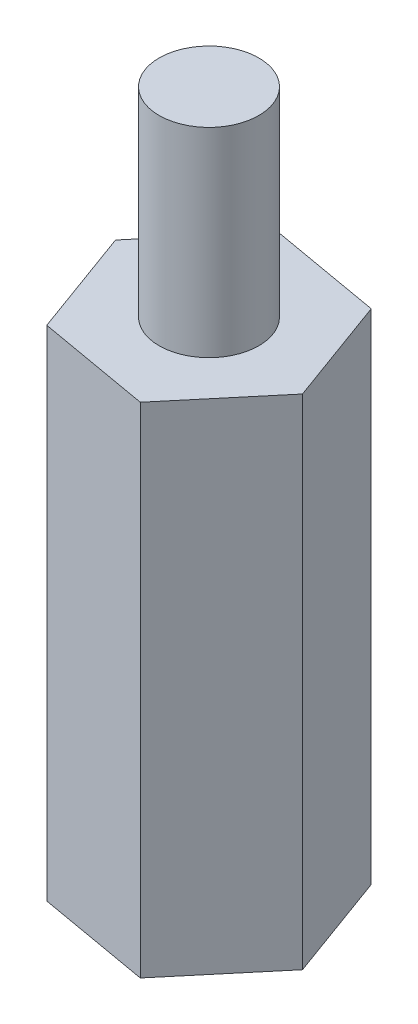
ISO-10303-21;
HEADER;
FILE_DESCRIPTION(('STEP AP214'),'2;1');
FILE_NAME('part.step','',(''),(''),'','','');
FILE_SCHEMA(('AUTOMOTIVE_DESIGN { 1 0 10303 214 1 1 1 1 }'));
ENDSEC;
DATA;
#1=APPLICATION_CONTEXT('core data for automotive mechanical design processes');
#2=APPLICATION_PROTOCOL_DEFINITION('international standard','automotive_design',2000,#1);
#3=PRODUCT_CONTEXT('',#1,'mechanical');
#4=PRODUCT('Part','Part','',(#3));
#5=PRODUCT_RELATED_PRODUCT_CATEGORY('part','',(#4));
#6=PRODUCT_DEFINITION_FORMATION('','',#4);
#7=PRODUCT_DEFINITION_CONTEXT('part definition',#1,'design');
#8=PRODUCT_DEFINITION('design','',#6,#7);
#9=PRODUCT_DEFINITION_SHAPE('','',#8);
#10=(LENGTH_UNIT() NAMED_UNIT(*) SI_UNIT(.MILLI.,.METRE.));
#11=(NAMED_UNIT(*) PLANE_ANGLE_UNIT() SI_UNIT($,.RADIAN.));
#12=(NAMED_UNIT(*) SI_UNIT($,.STERADIAN.) SOLID_ANGLE_UNIT());
#13=UNCERTAINTY_MEASURE_WITH_UNIT(LENGTH_MEASURE(1.E-05),#10,'distance_accuracy_value','');
#14=(GEOMETRIC_REPRESENTATION_CONTEXT(3) GLOBAL_UNCERTAINTY_ASSIGNED_CONTEXT((#13)) GLOBAL_UNIT_ASSIGNED_CONTEXT((#10,
#11,#12)) REPRESENTATION_CONTEXT('',''));
#15=CARTESIAN_POINT('',(0.,0.,0.));
#16=DIRECTION('',(0.,0.,1.));
#17=DIRECTION('',(1.,0.,0.));
#18=AXIS2_PLACEMENT_3D('',#15,#16,#17);
#19=CARTESIAN_POINT('',(-2.22472108843518,15.,2.65529962126156));
#20=DIRECTION('',(0.172920784330176,0.,-0.984935735135362));
#21=DIRECTION('',(-0.984935735135362,0.,-0.172920784330176));
#22=AXIS2_PLACEMENT_3D('',#19,#20,#21);
#23=PLANE('',#22);
#24=DIRECTION('',(0.984935735135362,0.,0.172920784330176));
#25=VECTOR('',#24,1.);
#26=CARTESIAN_POINT('',(-2.22472108843518,0.,2.65529962126156));
#27=LINE('',#26,#25);
#28=CARTESIAN_POINT('',(-2.22472108843518,0.,2.65529962126156));
#29=VERTEX_POINT('',#28);
#30=CARTESIAN_POINT('',(1.18719638245412,0.,3.25431478955061));
#31=VERTEX_POINT('',#30);
#32=EDGE_CURVE('E121',#29,#31,#27,.T.);
#33=ORIENTED_EDGE('',*,*,#32,.T.);
#34=DIRECTION('',(0.,-1.,0.));
#35=VECTOR('',#34,1.);
#36=CARTESIAN_POINT('',(1.18719638245412,15.,3.25431478955061));
#37=LINE('',#36,#35);
#38=CARTESIAN_POINT('',(1.18719638245412,15.,3.25431478955061));
#39=VERTEX_POINT('',#38);
#40=EDGE_CURVE('E38',#39,#31,#37,.T.);
#41=ORIENTED_EDGE('',*,*,#40,.F.);
#42=DIRECTION('',(0.984935735135362,0.,0.172920784330176));
#43=VECTOR('',#42,1.);
#44=CARTESIAN_POINT('',(-2.22472108843518,15.,2.65529962126156));
#45=LINE('',#44,#43);
#46=CARTESIAN_POINT('',(-2.22472108843518,15.,2.65529962126156));
#47=VERTEX_POINT('',#46);
#48=EDGE_CURVE('E132',#47,#39,#45,.T.);
#49=ORIENTED_EDGE('',*,*,#48,.F.);
#50=DIRECTION('',(0.,-1.,0.));
#51=VECTOR('',#50,1.);
#52=CARTESIAN_POINT('',(-2.22472108843518,15.,2.65529962126156));
#53=LINE('',#52,#51);
#54=EDGE_CURVE('E117',#47,#29,#53,.T.);
#55=ORIENTED_EDGE('',*,*,#54,.T.);
#56=EDGE_LOOP('',(#33,#41,#49,#55));
#57=FACE_BOUND('',#56,.T.);
#58=ADVANCED_FACE('F35',(#57),#23,.F.);
#59=CARTESIAN_POINT('',(1.18719638245412,15.,3.25431478955061));
#60=DIRECTION('',(-0.766518975557238,0.,-0.642221659639943));
#61=DIRECTION('',(-0.642221659639943,0.,0.766518975557238));
#62=AXIS2_PLACEMENT_3D('',#59,#60,#61);
#63=PLANE('',#62);
#64=DIRECTION('',(0.642221659639943,0.,-0.766518975557238));
#65=VECTOR('',#64,1.);
#66=CARTESIAN_POINT('',(1.18719638245412,0.,3.25431478955061));
#67=LINE('',#66,#65);
#68=CARTESIAN_POINT('',(3.4119174708893,0.,0.599015168289047));
#69=VERTEX_POINT('',#68);
#70=EDGE_CURVE('E124',#31,#69,#67,.T.);
#71=ORIENTED_EDGE('',*,*,#70,.T.);
#72=DIRECTION('',(0.,-1.,0.));
#73=VECTOR('',#72,1.);
#74=CARTESIAN_POINT('',(3.4119174708893,15.,0.599015168289047));
#75=LINE('',#74,#73);
#76=CARTESIAN_POINT('',(3.4119174708893,15.,0.599015168289047));
#77=VERTEX_POINT('',#76);
#78=EDGE_CURVE('E135',#77,#69,#75,.T.);
#79=ORIENTED_EDGE('',*,*,#78,.F.);
#80=DIRECTION('',(0.642221659639943,0.,-0.766518975557238));
#81=VECTOR('',#80,1.);
#82=CARTESIAN_POINT('',(1.18719638245412,15.,3.25431478955061));
#83=LINE('',#82,#81);
#84=EDGE_CURVE('E90',#39,#77,#83,.T.);
#85=ORIENTED_EDGE('',*,*,#84,.F.);
#86=ORIENTED_EDGE('',*,*,#40,.T.);
#87=EDGE_LOOP('',(#71,#79,#85,#86));
#88=FACE_BOUND('',#87,.T.);
#89=ADVANCED_FACE('F140',(#88),#63,.F.);
#90=CARTESIAN_POINT('',(3.4119174708893,15.,0.599015168289047));
#91=DIRECTION('',(-0.939439759887413,0.,0.342714075495419));
#92=DIRECTION('',(0.342714075495419,0.,0.939439759887413));
#93=AXIS2_PLACEMENT_3D('',#90,#91,#92);
#94=PLANE('',#93);
#95=DIRECTION('',(-0.342714075495419,0.,-0.939439759887413));
#96=VECTOR('',#95,1.);
#97=CARTESIAN_POINT('',(3.4119174708893,0.,0.599015168289047));
#98=LINE('',#97,#96);
#99=CARTESIAN_POINT('',(2.22472108843518,0.,-2.65529962126156));
#100=VERTEX_POINT('',#99);
#101=EDGE_CURVE('E127',#69,#100,#98,.T.);
#102=ORIENTED_EDGE('',*,*,#101,.T.);
#103=DIRECTION('',(0.,-1.,0.));
#104=VECTOR('',#103,1.);
#105=CARTESIAN_POINT('',(2.22472108843518,15.,-2.65529962126156));
#106=LINE('',#105,#104);
#107=CARTESIAN_POINT('',(2.22472108843518,15.,-2.65529962126156));
#108=VERTEX_POINT('',#107);
#109=EDGE_CURVE('E112',#108,#100,#106,.T.);
#110=ORIENTED_EDGE('',*,*,#109,.F.);
#111=DIRECTION('',(-0.342714075495419,0.,-0.939439759887413));
#112=VECTOR('',#111,1.);
#113=CARTESIAN_POINT('',(3.4119174708893,15.,0.599015168289047));
#114=LINE('',#113,#112);
#115=EDGE_CURVE('E103',#77,#108,#114,.T.);
#116=ORIENTED_EDGE('',*,*,#115,.F.);
#117=ORIENTED_EDGE('',*,*,#78,.T.);
#118=EDGE_LOOP('',(#102,#110,#116,#117));
#119=FACE_BOUND('',#118,.T.);
#120=ADVANCED_FACE('F146',(#119),#94,.F.);
#121=CARTESIAN_POINT('',(2.22472108843518,15.,-2.65529962126156));
#122=DIRECTION('',(-0.172920784330176,0.,0.984935735135362));
#123=DIRECTION('',(0.984935735135362,0.,0.172920784330176));
#124=AXIS2_PLACEMENT_3D('',#121,#122,#123);
#125=PLANE('',#124);
#126=DIRECTION('',(-0.984935735135362,0.,-0.172920784330176));
#127=VECTOR('',#126,1.);
#128=CARTESIAN_POINT('',(2.22472108843518,0.,-2.65529962126156));
#129=LINE('',#128,#127);
#130=CARTESIAN_POINT('',(-1.18719638245412,0.,-3.25431478955061));
#131=VERTEX_POINT('',#130);
#132=EDGE_CURVE('E111',#100,#131,#129,.T.);
#133=ORIENTED_EDGE('',*,*,#132,.T.);
#134=DIRECTION('',(0.,-1.,0.));
#135=VECTOR('',#134,1.);
#136=CARTESIAN_POINT('',(-1.18719638245412,15.,-3.25431478955061));
#137=LINE('',#136,#135);
#138=CARTESIAN_POINT('',(-1.18719638245412,15.,-3.25431478955061));
#139=VERTEX_POINT('',#138);
#140=EDGE_CURVE('E108',#139,#131,#137,.T.);
#141=ORIENTED_EDGE('',*,*,#140,.F.);
#142=DIRECTION('',(-0.984935735135362,0.,-0.172920784330176));
#143=VECTOR('',#142,1.);
#144=CARTESIAN_POINT('',(2.22472108843518,15.,-2.65529962126156));
#145=LINE('',#144,#143);
#146=EDGE_CURVE('E97',#108,#139,#145,.T.);
#147=ORIENTED_EDGE('',*,*,#146,.F.);
#148=ORIENTED_EDGE('',*,*,#109,.T.);
#149=EDGE_LOOP('',(#133,#141,#147,#148));
#150=FACE_BOUND('',#149,.T.);
#151=ADVANCED_FACE('F109',(#150),#125,.F.);
#152=CARTESIAN_POINT('',(-1.18719638245412,15.,-3.25431478955061));
#153=DIRECTION('',(0.766518975557237,0.,0.642221659639943));
#154=DIRECTION('',(0.642221659639943,0.,-0.766518975557238));
#155=AXIS2_PLACEMENT_3D('',#152,#153,#154);
#156=PLANE('',#155);
#157=DIRECTION('',(-0.642221659639943,0.,0.766518975557237));
#158=VECTOR('',#157,1.);
#159=CARTESIAN_POINT('',(-1.18719638245412,0.,-3.25431478955061));
#160=LINE('',#159,#158);
#161=CARTESIAN_POINT('',(-3.4119174708893,0.,-0.599015168289049));
#162=VERTEX_POINT('',#161);
#163=EDGE_CURVE('E75',#131,#162,#160,.T.);
#164=ORIENTED_EDGE('',*,*,#163,.T.);
#165=DIRECTION('',(0.,-1.,0.));
#166=VECTOR('',#165,1.);
#167=CARTESIAN_POINT('',(-3.4119174708893,15.,-0.599015168289049));
#168=LINE('',#167,#166);
#169=CARTESIAN_POINT('',(-3.4119174708893,15.,-0.599015168289049));
#170=VERTEX_POINT('',#169);
#171=EDGE_CURVE('E113',#170,#162,#168,.T.);
#172=ORIENTED_EDGE('',*,*,#171,.F.);
#173=DIRECTION('',(-0.642221659639943,0.,0.766518975557237));
#174=VECTOR('',#173,1.);
#175=CARTESIAN_POINT('',(-1.18719638245412,15.,-3.25431478955061));
#176=LINE('',#175,#174);
#177=EDGE_CURVE('E101',#139,#170,#176,.T.);
#178=ORIENTED_EDGE('',*,*,#177,.F.);
#179=ORIENTED_EDGE('',*,*,#140,.T.);
#180=EDGE_LOOP('',(#164,#172,#178,#179));
#181=FACE_BOUND('',#180,.T.);
#182=ADVANCED_FACE('F115',(#181),#156,.F.);
#183=CARTESIAN_POINT('',(-3.4119174708893,15.,-0.599015168289049));
#184=DIRECTION('',(0.939439759887413,0.,-0.342714075495419));
#185=DIRECTION('',(-0.342714075495419,0.,-0.939439759887413));
#186=AXIS2_PLACEMENT_3D('',#183,#184,#185);
#187=PLANE('',#186);
#188=DIRECTION('',(0.342714075495419,0.,0.939439759887413));
#189=VECTOR('',#188,1.);
#190=CARTESIAN_POINT('',(-3.4119174708893,0.,-0.599015168289049));
#191=LINE('',#190,#189);
#192=EDGE_CURVE('E81',#162,#29,#191,.T.);
#193=ORIENTED_EDGE('',*,*,#192,.T.);
#194=ORIENTED_EDGE('',*,*,#54,.F.);
#195=DIRECTION('',(0.342714075495419,0.,0.939439759887413));
#196=VECTOR('',#195,1.);
#197=CARTESIAN_POINT('',(-3.4119174708893,15.,-0.599015168289049));
#198=LINE('',#197,#196);
#199=EDGE_CURVE('E52',#170,#47,#198,.T.);
#200=ORIENTED_EDGE('',*,*,#199,.F.);
#201=ORIENTED_EDGE('',*,*,#171,.T.);
#202=EDGE_LOOP('',(#193,#194,#200,#201));
#203=FACE_BOUND('',#202,.T.);
#204=ADVANCED_FACE('F162',(#203),#187,.F.);
#205=CARTESIAN_POINT('',(0.,15.,0.));
#206=DIRECTION('',(0.,1.,0.));
#207=DIRECTION('',(0.,0.,1.));
#208=AXIS2_PLACEMENT_3D('',#205,#206,#207);
#209=PLANE('',#208);
#210=CARTESIAN_POINT('',(0.,15.,0.));
#211=DIRECTION('',(0.,1.,0.));
#212=DIRECTION('',(0.,0.,1.));
#213=AXIS2_PLACEMENT_3D('',#210,#211,#212);
#214=CIRCLE('',#213,1.5);
#215=CARTESIAN_POINT('',(0.,15.,1.5));
#216=VERTEX_POINT('',#215);
#217=EDGE_CURVE('E11',#216,#216,#214,.T.);
#218=ORIENTED_EDGE('',*,*,#217,.F.);
#219=EDGE_LOOP('',(#218));
#220=FACE_BOUND('',#219,.T.);
#221=ORIENTED_EDGE('',*,*,#48,.T.);
#222=ORIENTED_EDGE('',*,*,#84,.T.);
#223=ORIENTED_EDGE('',*,*,#115,.T.);
#224=ORIENTED_EDGE('',*,*,#146,.T.);
#225=ORIENTED_EDGE('',*,*,#177,.T.);
#226=ORIENTED_EDGE('',*,*,#199,.T.);
#227=EDGE_LOOP('',(#221,#222,#223,#224,#225,#226));
#228=FACE_BOUND('',#227,.T.);
#229=ADVANCED_FACE('F99',(#220,#228),#209,.T.);
#230=CARTESIAN_POINT('',(0.,0.,0.));
#231=DIRECTION('',(0.,1.,0.));
#232=DIRECTION('',(0.,0.,1.));
#233=AXIS2_PLACEMENT_3D('',#230,#231,#232);
#234=PLANE('',#233);
#235=ORIENTED_EDGE('',*,*,#32,.F.);
#236=ORIENTED_EDGE('',*,*,#192,.F.);
#237=ORIENTED_EDGE('',*,*,#163,.F.);
#238=ORIENTED_EDGE('',*,*,#132,.F.);
#239=ORIENTED_EDGE('',*,*,#101,.F.);
#240=ORIENTED_EDGE('',*,*,#70,.F.);
#241=EDGE_LOOP('',(#235,#236,#237,#238,#239,#240));
#242=FACE_BOUND('',#241,.T.);
#243=ADVANCED_FACE('F145',(#242),#234,.F.);
#244=CARTESIAN_POINT('',(0.,21.,0.));
#245=DIRECTION('',(0.,-1.,0.));
#246=DIRECTION('',(0.,0.,-1.));
#247=AXIS2_PLACEMENT_3D('',#244,#245,#246);
#248=CYLINDRICAL_SURFACE('',#247,1.5);
#249=CARTESIAN_POINT('',(0.,21.,0.));
#250=DIRECTION('',(0.,1.,0.));
#251=DIRECTION('',(0.,0.,1.));
#252=AXIS2_PLACEMENT_3D('',#249,#250,#251);
#253=CIRCLE('',#252,1.5);
#254=CARTESIAN_POINT('',(0.,21.,1.5));
#255=VERTEX_POINT('',#254);
#256=EDGE_CURVE('E125',#255,#255,#253,.T.);
#257=ORIENTED_EDGE('',*,*,#256,.F.);
#258=EDGE_LOOP('',(#257));
#259=FACE_BOUND('',#258,.T.);
#260=ORIENTED_EDGE('',*,*,#217,.T.);
#261=EDGE_LOOP('',(#260));
#262=FACE_BOUND('',#261,.T.);
#263=ADVANCED_FACE('F155',(#259,#262),#248,.T.);
#264=CARTESIAN_POINT('',(0.,21.,0.));
#265=DIRECTION('',(0.,1.,0.));
#266=DIRECTION('',(0.,0.,1.));
#267=AXIS2_PLACEMENT_3D('',#264,#265,#266);
#268=PLANE('',#267);
#269=ORIENTED_EDGE('',*,*,#256,.T.);
#270=EDGE_LOOP('',(#269));
#271=FACE_BOUND('',#270,.T.);
#272=ADVANCED_FACE('F153',(#271),#268,.T.);
#273=CLOSED_SHELL('',(#58,#89,#120,#151,#182,#204,#229,#243,#263,#272));
#274=MANIFOLD_SOLID_BREP('B2',#273);
#275=ADVANCED_BREP_SHAPE_REPRESENTATION('',(#18,#274),#14);
#276=SHAPE_DEFINITION_REPRESENTATION(#9,#275);
ENDSEC;
END-ISO-10303-21;
